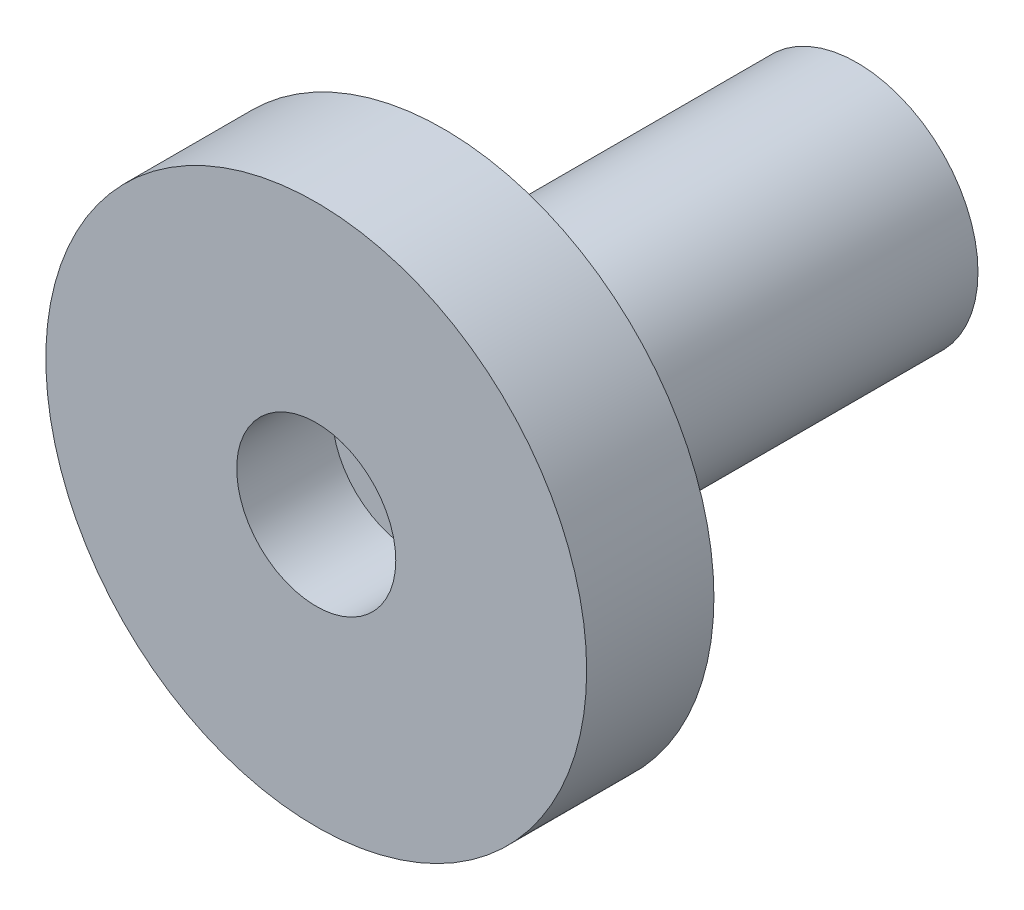
ISO-10303-21;
HEADER;
FILE_DESCRIPTION(('STEP AP214'),'2;1');
FILE_NAME('part.step','',(''),(''),'','','');
FILE_SCHEMA(('AUTOMOTIVE_DESIGN { 1 0 10303 214 1 1 1 1 }'));
ENDSEC;
DATA;
#1=APPLICATION_CONTEXT('core data for automotive mechanical design processes');
#2=APPLICATION_PROTOCOL_DEFINITION('international standard','automotive_design',2000,#1);
#3=PRODUCT_CONTEXT('',#1,'mechanical');
#4=PRODUCT('Part','Part','',(#3));
#5=PRODUCT_RELATED_PRODUCT_CATEGORY('part','',(#4));
#6=PRODUCT_DEFINITION_FORMATION('','',#4);
#7=PRODUCT_DEFINITION_CONTEXT('part definition',#1,'design');
#8=PRODUCT_DEFINITION('design','',#6,#7);
#9=PRODUCT_DEFINITION_SHAPE('','',#8);
#10=(LENGTH_UNIT() NAMED_UNIT(*) SI_UNIT(.MILLI.,.METRE.));
#11=(NAMED_UNIT(*) PLANE_ANGLE_UNIT() SI_UNIT($,.RADIAN.));
#12=(NAMED_UNIT(*) SI_UNIT($,.STERADIAN.) SOLID_ANGLE_UNIT());
#13=UNCERTAINTY_MEASURE_WITH_UNIT(LENGTH_MEASURE(1.E-05),#10,'distance_accuracy_value','');
#14=(GEOMETRIC_REPRESENTATION_CONTEXT(3) GLOBAL_UNCERTAINTY_ASSIGNED_CONTEXT((#13)) GLOBAL_UNIT_ASSIGNED_CONTEXT((#10,
#11,#12)) REPRESENTATION_CONTEXT('',''));
#15=CARTESIAN_POINT('',(0.,0.,0.));
#16=DIRECTION('',(0.,0.,1.));
#17=DIRECTION('',(1.,0.,0.));
#18=AXIS2_PLACEMENT_3D('',#15,#16,#17);
#19=CARTESIAN_POINT('',(-58.8000000000001,0.,-8.));
#20=DIRECTION('',(0.,0.,1.));
#21=DIRECTION('',(1.,0.,0.));
#22=AXIS2_PLACEMENT_3D('',#19,#20,#21);
#23=CYLINDRICAL_SURFACE('',#22,1.6);
#24=CARTESIAN_POINT('',(-58.8000000000001,0.,-8.));
#25=DIRECTION('',(0.,0.,1.));
#26=DIRECTION('',(1.,0.,0.));
#27=AXIS2_PLACEMENT_3D('',#24,#25,#26);
#28=CIRCLE('',#27,1.6);
#29=CARTESIAN_POINT('',(-57.2000000000001,0.,-8.));
#30=VERTEX_POINT('',#29);
#31=EDGE_CURVE('E38',#30,#30,#28,.T.);
#32=ORIENTED_EDGE('',*,*,#31,.F.);
#33=EDGE_LOOP('',(#32));
#34=FACE_BOUND('',#33,.T.);
#35=CARTESIAN_POINT('',(-58.8000000000001,0.,6.));
#36=DIRECTION('',(0.,0.,1.));
#37=DIRECTION('',(1.,0.,0.));
#38=AXIS2_PLACEMENT_3D('',#35,#36,#37);
#39=CIRCLE('',#38,1.6);
#40=CARTESIAN_POINT('',(-57.2000000000001,0.,6.));
#41=VERTEX_POINT('',#40);
#42=EDGE_CURVE('E34',#41,#41,#39,.F.);
#43=ORIENTED_EDGE('',*,*,#42,.F.);
#44=EDGE_LOOP('',(#43));
#45=FACE_BOUND('',#44,.T.);
#46=ADVANCED_FACE('F30',(#34,#45),#23,.F.);
#47=CARTESIAN_POINT('',(-58.8000000000001,0.,-8.));
#48=DIRECTION('',(0.,0.,1.));
#49=DIRECTION('',(1.,0.,0.));
#50=AXIS2_PLACEMENT_3D('',#47,#48,#49);
#51=CYLINDRICAL_SURFACE('',#50,3.8);
#52=CARTESIAN_POINT('',(-58.8000000000001,0.,-8.));
#53=DIRECTION('',(0.,0.,1.));
#54=DIRECTION('',(1.,0.,0.));
#55=AXIS2_PLACEMENT_3D('',#52,#53,#54);
#56=CIRCLE('',#55,3.8);
#57=CARTESIAN_POINT('',(-55.0000000000001,0.,-8.));
#58=VERTEX_POINT('',#57);
#59=EDGE_CURVE('E10',#58,#58,#56,.T.);
#60=ORIENTED_EDGE('',*,*,#59,.T.);
#61=EDGE_LOOP('',(#60));
#62=FACE_BOUND('',#61,.T.);
#63=CARTESIAN_POINT('',(-58.8000000000001,0.,5.));
#64=DIRECTION('',(0.,0.,1.));
#65=DIRECTION('',(1.,0.,0.));
#66=AXIS2_PLACEMENT_3D('',#63,#64,#65);
#67=CIRCLE('',#66,3.8);
#68=CARTESIAN_POINT('',(-55.0000000000001,0.,5.));
#69=VERTEX_POINT('',#68);
#70=EDGE_CURVE('E42',#69,#69,#67,.T.);
#71=ORIENTED_EDGE('',*,*,#70,.F.);
#72=EDGE_LOOP('',(#71));
#73=FACE_BOUND('',#72,.T.);
#74=ADVANCED_FACE('F32',(#62,#73),#51,.T.);
#75=CARTESIAN_POINT('',(-58.8000000000001,0.,-8.));
#76=DIRECTION('',(0.,0.,1.));
#77=DIRECTION('',(1.,0.,0.));
#78=AXIS2_PLACEMENT_3D('',#75,#76,#77);
#79=PLANE('',#78);
#80=ORIENTED_EDGE('',*,*,#31,.T.);
#81=EDGE_LOOP('',(#80));
#82=FACE_BOUND('',#81,.T.);
#83=ORIENTED_EDGE('',*,*,#59,.F.);
#84=EDGE_LOOP('',(#83));
#85=FACE_BOUND('',#84,.T.);
#86=ADVANCED_FACE('F71',(#82,#85),#79,.F.);
#87=CARTESIAN_POINT('',(-58.8000000000001,0.,9.));
#88=DIRECTION('',(0.,0.,-1.));
#89=DIRECTION('',(-1.,0.,0.));
#90=AXIS2_PLACEMENT_3D('',#87,#88,#89);
#91=CYLINDRICAL_SURFACE('',#90,8.5);
#92=CARTESIAN_POINT('',(-58.8000000000001,0.,9.));
#93=DIRECTION('',(0.,0.,1.));
#94=DIRECTION('',(1.,0.,0.));
#95=AXIS2_PLACEMENT_3D('',#92,#93,#94);
#96=CIRCLE('',#95,8.5);
#97=CARTESIAN_POINT('',(-50.3000000000001,0.,9.));
#98=VERTEX_POINT('',#97);
#99=EDGE_CURVE('E47',#98,#98,#96,.T.);
#100=ORIENTED_EDGE('',*,*,#99,.F.);
#101=EDGE_LOOP('',(#100));
#102=FACE_BOUND('',#101,.T.);
#103=CARTESIAN_POINT('',(-58.8000000000001,0.,5.));
#104=DIRECTION('',(0.,0.,1.));
#105=DIRECTION('',(1.,0.,0.));
#106=AXIS2_PLACEMENT_3D('',#103,#104,#105);
#107=CIRCLE('',#106,8.5);
#108=CARTESIAN_POINT('',(-50.3000000000001,0.,5.));
#109=VERTEX_POINT('',#108);
#110=EDGE_CURVE('E48',#109,#109,#107,.T.);
#111=ORIENTED_EDGE('',*,*,#110,.T.);
#112=EDGE_LOOP('',(#111));
#113=FACE_BOUND('',#112,.T.);
#114=ADVANCED_FACE('F74',(#102,#113),#91,.T.);
#115=CARTESIAN_POINT('',(-58.8000000000001,0.,9.));
#116=DIRECTION('',(0.,0.,1.));
#117=DIRECTION('',(1.,0.,0.));
#118=AXIS2_PLACEMENT_3D('',#115,#116,#117);
#119=PLANE('',#118);
#120=CARTESIAN_POINT('',(-58.8000000000001,0.,9.));
#121=DIRECTION('',(0.,0.,1.));
#122=DIRECTION('',(1.,0.,0.));
#123=AXIS2_PLACEMENT_3D('',#120,#121,#122);
#124=CIRCLE('',#123,2.5);
#125=CARTESIAN_POINT('',(-56.3000000000001,0.,9.));
#126=VERTEX_POINT('',#125);
#127=EDGE_CURVE('E53',#126,#126,#124,.T.);
#128=ORIENTED_EDGE('',*,*,#127,.F.);
#129=EDGE_LOOP('',(#128));
#130=FACE_BOUND('',#129,.T.);
#131=ORIENTED_EDGE('',*,*,#99,.T.);
#132=EDGE_LOOP('',(#131));
#133=FACE_BOUND('',#132,.T.);
#134=ADVANCED_FACE('F81',(#130,#133),#119,.T.);
#135=CARTESIAN_POINT('',(-58.8000000000001,0.,5.));
#136=DIRECTION('',(0.,0.,1.));
#137=DIRECTION('',(1.,0.,0.));
#138=AXIS2_PLACEMENT_3D('',#135,#136,#137);
#139=PLANE('',#138);
#140=ORIENTED_EDGE('',*,*,#70,.T.);
#141=EDGE_LOOP('',(#140));
#142=FACE_BOUND('',#141,.T.);
#143=ORIENTED_EDGE('',*,*,#110,.F.);
#144=EDGE_LOOP('',(#143));
#145=FACE_BOUND('',#144,.T.);
#146=ADVANCED_FACE('F87',(#142,#145),#139,.F.);
#147=CARTESIAN_POINT('',(-58.8000000000001,0.,6.));
#148=DIRECTION('',(0.,0.,1.));
#149=DIRECTION('',(1.,0.,0.));
#150=AXIS2_PLACEMENT_3D('',#147,#148,#149);
#151=PLANE('',#150);
#152=CARTESIAN_POINT('',(-58.8000000000001,0.,6.));
#153=DIRECTION('',(0.,0.,1.));
#154=DIRECTION('',(1.,0.,0.));
#155=AXIS2_PLACEMENT_3D('',#152,#153,#154);
#156=CIRCLE('',#155,2.5);
#157=CARTESIAN_POINT('',(-56.3000000000001,0.,6.));
#158=VERTEX_POINT('',#157);
#159=EDGE_CURVE('E56',#158,#158,#156,.T.);
#160=ORIENTED_EDGE('',*,*,#159,.T.);
#161=EDGE_LOOP('',(#160));
#162=FACE_BOUND('',#161,.T.);
#163=ORIENTED_EDGE('',*,*,#42,.T.);
#164=EDGE_LOOP('',(#163));
#165=FACE_BOUND('',#164,.T.);
#166=ADVANCED_FACE('F63',(#162,#165),#151,.T.);
#167=CARTESIAN_POINT('',(-58.8000000000001,0.,6.));
#168=DIRECTION('',(0.,0.,1.));
#169=DIRECTION('',(1.,0.,0.));
#170=AXIS2_PLACEMENT_3D('',#167,#168,#169);
#171=CYLINDRICAL_SURFACE('',#170,2.5);
#172=ORIENTED_EDGE('',*,*,#159,.F.);
#173=EDGE_LOOP('',(#172));
#174=FACE_BOUND('',#173,.T.);
#175=ORIENTED_EDGE('',*,*,#127,.T.);
#176=EDGE_LOOP('',(#175));
#177=FACE_BOUND('',#176,.T.);
#178=ADVANCED_FACE('F99',(#174,#177),#171,.F.);
#179=CLOSED_SHELL('',(#46,#74,#86,#114,#134,#146,#166,#178));
#180=MANIFOLD_SOLID_BREP('B2',#179);
#181=ADVANCED_BREP_SHAPE_REPRESENTATION('',(#18,#180),#14);
#182=SHAPE_DEFINITION_REPRESENTATION(#9,#181);
ENDSEC;
END-ISO-10303-21;
